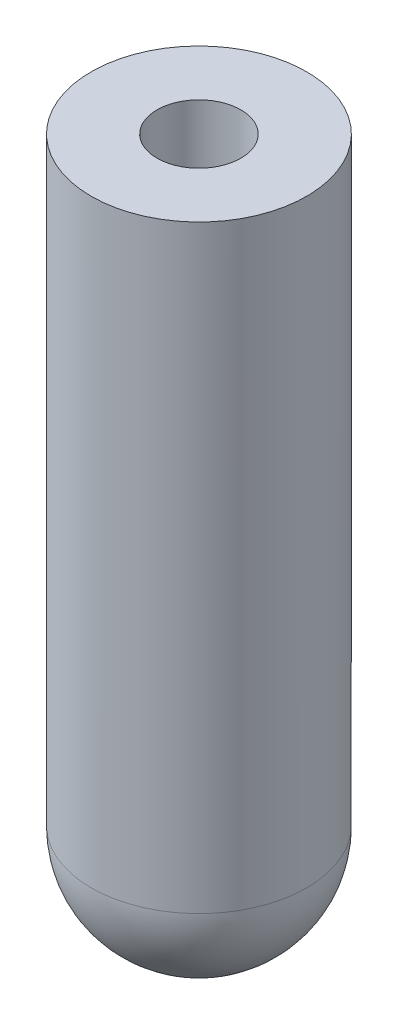
ISO-10303-21;
HEADER;
FILE_DESCRIPTION(('STEP AP214'),'2;1');
FILE_NAME('part.step','',(''),(''),'','','');
FILE_SCHEMA(('AUTOMOTIVE_DESIGN { 1 0 10303 214 1 1 1 1 }'));
ENDSEC;
DATA;
#1=APPLICATION_CONTEXT('core data for automotive mechanical design processes');
#2=APPLICATION_PROTOCOL_DEFINITION('international standard','automotive_design',2000,#1);
#3=PRODUCT_CONTEXT('',#1,'mechanical');
#4=PRODUCT('Part','Part','',(#3));
#5=PRODUCT_RELATED_PRODUCT_CATEGORY('part','',(#4));
#6=PRODUCT_DEFINITION_FORMATION('','',#4);
#7=PRODUCT_DEFINITION_CONTEXT('part definition',#1,'design');
#8=PRODUCT_DEFINITION('design','',#6,#7);
#9=PRODUCT_DEFINITION_SHAPE('','',#8);
#10=(LENGTH_UNIT() NAMED_UNIT(*) SI_UNIT(.MILLI.,.METRE.));
#11=(NAMED_UNIT(*) PLANE_ANGLE_UNIT() SI_UNIT($,.RADIAN.));
#12=(NAMED_UNIT(*) SI_UNIT($,.STERADIAN.) SOLID_ANGLE_UNIT());
#13=UNCERTAINTY_MEASURE_WITH_UNIT(LENGTH_MEASURE(1.E-05),#10,'distance_accuracy_value','');
#14=(GEOMETRIC_REPRESENTATION_CONTEXT(3) GLOBAL_UNCERTAINTY_ASSIGNED_CONTEXT((#13)) GLOBAL_UNIT_ASSIGNED_CONTEXT((#10,
#11,#12)) REPRESENTATION_CONTEXT('',''));
#15=CARTESIAN_POINT('',(0.,0.,0.));
#16=DIRECTION('',(0.,0.,1.));
#17=DIRECTION('',(1.,0.,0.));
#18=AXIS2_PLACEMENT_3D('',#15,#16,#17);
#19=CARTESIAN_POINT('',(0.,-50.,0.));
#20=DIRECTION('',(0.,1.,0.));
#21=DIRECTION('',(0.,0.,1.));
#22=AXIS2_PLACEMENT_3D('',#19,#20,#21);
#23=CYLINDRICAL_SURFACE('',#22,9.);
#24=CARTESIAN_POINT('',(0.,-50.,0.));
#25=DIRECTION('',(0.,1.,0.));
#26=DIRECTION('',(0.,0.,-1.));
#27=AXIS2_PLACEMENT_3D('',#24,#25,#26);
#28=CIRCLE('',#27,9.);
#29=CARTESIAN_POINT('',(0.,-50.,-9.));
#30=VERTEX_POINT('',#29);
#31=EDGE_CURVE('E46',#30,#30,#28,.T.);
#32=ORIENTED_EDGE('',*,*,#31,.T.);
#33=EDGE_LOOP('',(#32));
#34=FACE_BOUND('',#33,.T.);
#35=CARTESIAN_POINT('',(0.,0.,0.));
#36=DIRECTION('',(0.,1.,0.));
#37=DIRECTION('',(0.,0.,1.));
#38=AXIS2_PLACEMENT_3D('',#35,#36,#37);
#39=CIRCLE('',#38,9.);
#40=CARTESIAN_POINT('',(0.,0.,9.));
#41=VERTEX_POINT('',#40);
#42=EDGE_CURVE('E10',#41,#41,#39,.T.);
#43=ORIENTED_EDGE('',*,*,#42,.F.);
#44=EDGE_LOOP('',(#43));
#45=FACE_BOUND('',#44,.T.);
#46=ADVANCED_FACE('F31',(#34,#45),#23,.T.);
#47=CARTESIAN_POINT('',(0.,0.,0.));
#48=DIRECTION('',(0.,1.,0.));
#49=DIRECTION('',(0.,0.,1.));
#50=AXIS2_PLACEMENT_3D('',#47,#48,#49);
#51=PLANE('',#50);
#52=CARTESIAN_POINT('',(0.,0.,0.));
#53=DIRECTION('',(0.,1.,0.));
#54=DIRECTION('',(0.,0.,1.));
#55=AXIS2_PLACEMENT_3D('',#52,#53,#54);
#56=CIRCLE('',#55,3.5);
#57=CARTESIAN_POINT('',(0.,0.,3.5));
#58=VERTEX_POINT('',#57);
#59=EDGE_CURVE('E41',#58,#58,#56,.T.);
#60=ORIENTED_EDGE('',*,*,#59,.F.);
#61=EDGE_LOOP('',(#60));
#62=FACE_BOUND('',#61,.T.);
#63=ORIENTED_EDGE('',*,*,#42,.T.);
#64=EDGE_LOOP('',(#63));
#65=FACE_BOUND('',#64,.T.);
#66=ADVANCED_FACE('F64',(#62,#65),#51,.T.);
#67=CARTESIAN_POINT('',(0.,-50.,0.));
#68=DIRECTION('',(0.,1.,0.));
#69=DIRECTION('',(0.,0.,1.));
#70=AXIS2_PLACEMENT_3D('',#67,#68,#69);
#71=CYLINDRICAL_SURFACE('',#70,3.5);
#72=CARTESIAN_POINT('',(0.,-50.,0.));
#73=DIRECTION('',(0.,1.,0.));
#74=DIRECTION('',(0.,0.,1.));
#75=AXIS2_PLACEMENT_3D('',#72,#73,#74);
#76=CIRCLE('',#75,3.5);
#77=CARTESIAN_POINT('',(0.,-50.,3.5));
#78=VERTEX_POINT('',#77);
#79=EDGE_CURVE('E37',#78,#78,#76,.T.);
#80=ORIENTED_EDGE('',*,*,#79,.F.);
#81=EDGE_LOOP('',(#80));
#82=FACE_BOUND('',#81,.T.);
#83=ORIENTED_EDGE('',*,*,#59,.T.);
#84=EDGE_LOOP('',(#83));
#85=FACE_BOUND('',#84,.T.);
#86=ADVANCED_FACE('F60',(#82,#85),#71,.F.);
#87=CARTESIAN_POINT('',(0.,-50.,0.));
#88=DIRECTION('',(0.,1.,0.));
#89=DIRECTION('',(0.,0.,-1.));
#90=AXIS2_PLACEMENT_3D('',#87,#88,#89);
#91=PLANE('',#90);
#92=ORIENTED_EDGE('',*,*,#79,.T.);
#93=EDGE_LOOP('',(#92));
#94=FACE_BOUND('',#93,.T.);
#95=ADVANCED_FACE('F55',(#94),#91,.T.);
#96=CARTESIAN_POINT('',(0.,-50.,0.));
#97=DIRECTION('',(0.,0.,1.));
#98=DIRECTION('',(-1.,0.,0.));
#99=AXIS2_PLACEMENT_3D('',#96,#97,#98);
#100=SPHERICAL_SURFACE('',#99,9.);
#101=CARTESIAN_POINT('',(0.,-50.,0.));
#102=DIRECTION('',(0.,1.,0.));
#103=DIRECTION('',(0.,0.,-1.));
#104=AXIS2_PLACEMENT_3D('',#101,#102,#103);
#105=SPHERICAL_SURFACE('',#104,9.);
#106=ORIENTED_EDGE('',*,*,#31,.F.);
#107=EDGE_LOOP('',(#106));
#108=FACE_BOUND('',#107,.T.);
#109=ADVANCED_FACE('F53',(#108),#105,.T.);
#110=CLOSED_SHELL('',(#46,#66,#86,#95,#109));
#111=MANIFOLD_SOLID_BREP('B2',#110);
#112=ADVANCED_BREP_SHAPE_REPRESENTATION('',(#18,#111),#14);
#113=SHAPE_DEFINITION_REPRESENTATION(#9,#112);
ENDSEC;
END-ISO-10303-21;
